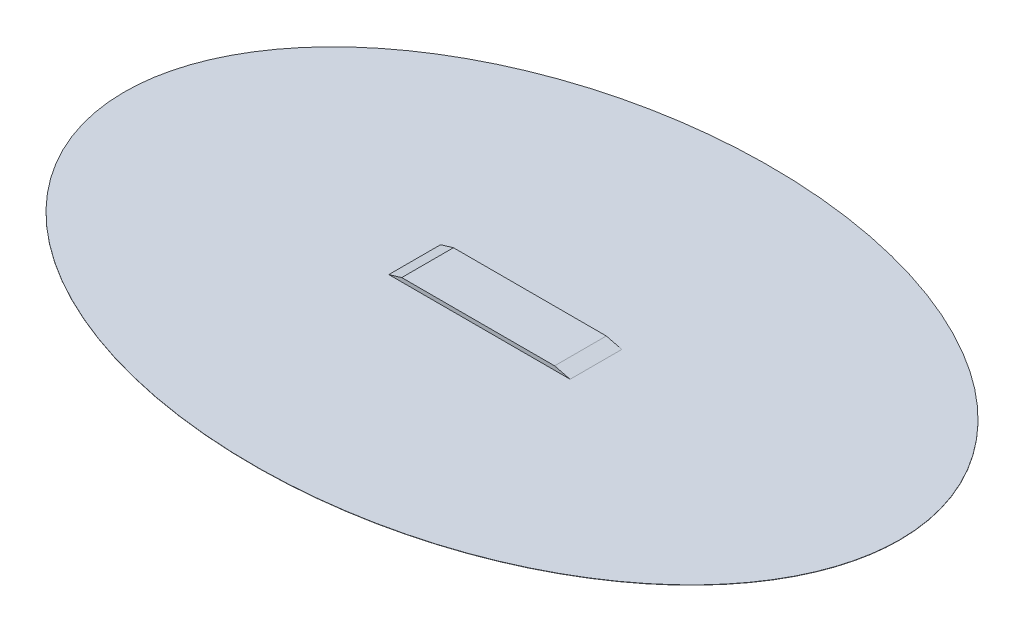
ISO-10303-21;
HEADER;
FILE_DESCRIPTION(('STEP AP214'),'2;1');
FILE_NAME('part.step','',(''),(''),'','','');
FILE_SCHEMA(('AUTOMOTIVE_DESIGN { 1 0 10303 214 1 1 1 1 }'));
ENDSEC;
DATA;
#1=APPLICATION_CONTEXT('core data for automotive mechanical design processes');
#2=APPLICATION_PROTOCOL_DEFINITION('international standard','automotive_design',2000,#1);
#3=PRODUCT_CONTEXT('',#1,'mechanical');
#4=PRODUCT('Part','Part','',(#3));
#5=PRODUCT_RELATED_PRODUCT_CATEGORY('part','',(#4));
#6=PRODUCT_DEFINITION_FORMATION('','',#4);
#7=PRODUCT_DEFINITION_CONTEXT('part definition',#1,'design');
#8=PRODUCT_DEFINITION('design','',#6,#7);
#9=PRODUCT_DEFINITION_SHAPE('','',#8);
#10=(LENGTH_UNIT() NAMED_UNIT(*) SI_UNIT(.MILLI.,.METRE.));
#11=(NAMED_UNIT(*) PLANE_ANGLE_UNIT() SI_UNIT($,.RADIAN.));
#12=(NAMED_UNIT(*) SI_UNIT($,.STERADIAN.) SOLID_ANGLE_UNIT());
#13=UNCERTAINTY_MEASURE_WITH_UNIT(LENGTH_MEASURE(1.E-05),#10,'distance_accuracy_value','');
#14=(GEOMETRIC_REPRESENTATION_CONTEXT(3) GLOBAL_UNCERTAINTY_ASSIGNED_CONTEXT((#13)) GLOBAL_UNIT_ASSIGNED_CONTEXT((#10,
#11,#12)) REPRESENTATION_CONTEXT('',''));
#15=CARTESIAN_POINT('',(0.,0.,0.));
#16=DIRECTION('',(0.,0.,1.));
#17=DIRECTION('',(1.,0.,0.));
#18=AXIS2_PLACEMENT_3D('',#15,#16,#17);
#19=CARTESIAN_POINT('',(0.,10.,0.));
#20=DIRECTION('',(0.,1.,0.));
#21=DIRECTION('',(1.,0.,0.));
#22=AXIS2_PLACEMENT_3D('',#19,#20,#21);
#23=ELLIPSE('',#22,15000.,10000.);
#24=DIRECTION('',(0.,-1.,0.));
#25=VECTOR('',#24,1.);
#26=SURFACE_OF_LINEAR_EXTRUSION('',#23,#25);
#27=CARTESIAN_POINT('',(15000.,10.,0.));
#28=VERTEX_POINT('',#27);
#29=EDGE_CURVE('E11',#28,#28,#23,.T.);
#30=ORIENTED_EDGE('',*,*,#29,.F.);
#31=EDGE_LOOP('',(#30));
#32=FACE_BOUND('',#31,.T.);
#33=CARTESIAN_POINT('',(0.,0.,0.));
#34=DIRECTION('',(0.,1.,0.));
#35=DIRECTION('',(1.,0.,0.));
#36=AXIS2_PLACEMENT_3D('',#33,#34,#35);
#37=ELLIPSE('',#36,15000.,10000.);
#38=CARTESIAN_POINT('',(15000.,0.,0.));
#39=VERTEX_POINT('',#38);
#40=EDGE_CURVE('E43',#39,#39,#37,.T.);
#41=ORIENTED_EDGE('',*,*,#40,.T.);
#42=EDGE_LOOP('',(#41));
#43=FACE_BOUND('',#42,.T.);
#44=ADVANCED_FACE('F39',(#32,#43),#26,.F.);
#45=CARTESIAN_POINT('',(0.,10.,0.));
#46=DIRECTION('',(0.,1.,0.));
#47=DIRECTION('',(0.,0.,1.));
#48=AXIS2_PLACEMENT_3D('',#45,#46,#47);
#49=PLANE('',#48);
#50=DIRECTION('',(1.,0.,0.));
#51=VECTOR('',#50,1.);
#52=CARTESIAN_POINT('',(3247.58058331461,10.,-1000.));
#53=LINE('',#52,#51);
#54=CARTESIAN_POINT('',(-3765.65306220773,10.,-1000.));
#55=VERTEX_POINT('',#54);
#56=CARTESIAN_POINT('',(3247.58058331461,10.,-1000.));
#57=VERTEX_POINT('',#56);
#58=EDGE_CURVE('E62',#55,#57,#53,.T.);
#59=ORIENTED_EDGE('',*,*,#58,.T.);
#60=DIRECTION('',(0.,0.,1.));
#61=VECTOR('',#60,1.);
#62=CARTESIAN_POINT('',(3247.58058331461,10.,-1000.));
#63=LINE('',#62,#61);
#64=CARTESIAN_POINT('',(3247.58058331461,10.,1000.));
#65=VERTEX_POINT('',#64);
#66=EDGE_CURVE('E87',#57,#65,#63,.T.);
#67=ORIENTED_EDGE('',*,*,#66,.T.);
#68=DIRECTION('',(1.,0.,0.));
#69=VECTOR('',#68,1.);
#70=CARTESIAN_POINT('',(3247.58058331461,10.,1000.));
#71=LINE('',#70,#69);
#72=CARTESIAN_POINT('',(-3765.65306220773,10.,1000.));
#73=VERTEX_POINT('',#72);
#74=EDGE_CURVE('E92',#73,#65,#71,.T.);
#75=ORIENTED_EDGE('',*,*,#74,.F.);
#76=DIRECTION('',(0.,0.,1.));
#77=VECTOR('',#76,1.);
#78=CARTESIAN_POINT('',(-3765.65306220773,10.,-1000.));
#79=LINE('',#78,#77);
#80=EDGE_CURVE('E115',#55,#73,#79,.T.);
#81=ORIENTED_EDGE('',*,*,#80,.F.);
#82=EDGE_LOOP('',(#59,#67,#75,#81));
#83=FACE_BOUND('',#82,.T.);
#84=ORIENTED_EDGE('',*,*,#29,.T.);
#85=EDGE_LOOP('',(#84));
#86=FACE_BOUND('',#85,.T.);
#87=ADVANCED_FACE('F100',(#83,#86),#49,.T.);
#88=CARTESIAN_POINT('',(0.,0.,0.));
#89=DIRECTION('',(0.,1.,0.));
#90=DIRECTION('',(0.,0.,1.));
#91=AXIS2_PLACEMENT_3D('',#88,#89,#90);
#92=PLANE('',#91);
#93=ORIENTED_EDGE('',*,*,#40,.F.);
#94=EDGE_LOOP('',(#93));
#95=FACE_BOUND('',#94,.T.);
#96=ADVANCED_FACE('F142',(#95),#92,.F.);
#97=CARTESIAN_POINT('',(-3765.65306220773,10.,-1000.));
#98=DIRECTION('',(-0.287347885566344,0.957826285221152,0.));
#99=DIRECTION('',(-0.957826285221152,-0.287347885566344,0.));
#100=AXIS2_PLACEMENT_3D('',#97,#98,#99);
#101=PLANE('',#100);
#102=ORIENTED_EDGE('',*,*,#80,.T.);
#103=DIRECTION('',(-0.957826285221152,-0.287347885566344,0.));
#104=VECTOR('',#103,1.);
#105=CARTESIAN_POINT('',(-3765.65306220773,10.,1000.));
#106=LINE('',#105,#104);
#107=CARTESIAN_POINT('',(-3265.65306220773,159.999999999999,1000.));
#108=VERTEX_POINT('',#107);
#109=EDGE_CURVE('E54',#108,#73,#106,.T.);
#110=ORIENTED_EDGE('',*,*,#109,.F.);
#111=DIRECTION('',(0.,0.,1.));
#112=VECTOR('',#111,1.);
#113=CARTESIAN_POINT('',(-3265.65306220773,159.999999999999,-1000.));
#114=LINE('',#113,#112);
#115=CARTESIAN_POINT('',(-3265.65306220773,159.999999999999,-1000.));
#116=VERTEX_POINT('',#115);
#117=EDGE_CURVE('E107',#116,#108,#114,.T.);
#118=ORIENTED_EDGE('',*,*,#117,.F.);
#119=DIRECTION('',(-0.957826285221152,-0.287347885566344,0.));
#120=VECTOR('',#119,1.);
#121=CARTESIAN_POINT('',(-3765.65306220773,10.,-1000.));
#122=LINE('',#121,#120);
#123=EDGE_CURVE('E103',#116,#55,#122,.T.);
#124=ORIENTED_EDGE('',*,*,#123,.T.);
#125=EDGE_LOOP('',(#102,#110,#118,#124));
#126=FACE_BOUND('',#125,.T.);
#127=ADVANCED_FACE('F131',(#126),#101,.T.);
#128=CARTESIAN_POINT('',(-3265.65306220773,159.999999999999,-1000.));
#129=DIRECTION('',(0.,1.,0.));
#130=DIRECTION('',(0.,0.,1.));
#131=AXIS2_PLACEMENT_3D('',#128,#129,#130);
#132=PLANE('',#131);
#133=ORIENTED_EDGE('',*,*,#117,.T.);
#134=DIRECTION('',(-1.,0.,0.));
#135=VECTOR('',#134,1.);
#136=CARTESIAN_POINT('',(-3265.65306220773,159.999999999999,1000.));
#137=LINE('',#136,#135);
#138=CARTESIAN_POINT('',(2647.58058331461,159.999999999999,1000.));
#139=VERTEX_POINT('',#138);
#140=EDGE_CURVE('E91',#139,#108,#137,.T.);
#141=ORIENTED_EDGE('',*,*,#140,.F.);
#142=DIRECTION('',(0.,0.,1.));
#143=VECTOR('',#142,1.);
#144=CARTESIAN_POINT('',(2647.58058331461,159.999999999999,-1000.));
#145=LINE('',#144,#143);
#146=CARTESIAN_POINT('',(2647.58058331461,159.999999999999,-1000.));
#147=VERTEX_POINT('',#146);
#148=EDGE_CURVE('E88',#147,#139,#145,.T.);
#149=ORIENTED_EDGE('',*,*,#148,.F.);
#150=DIRECTION('',(-1.,0.,0.));
#151=VECTOR('',#150,1.);
#152=CARTESIAN_POINT('',(-3265.65306220773,159.999999999999,-1000.));
#153=LINE('',#152,#151);
#154=EDGE_CURVE('E109',#147,#116,#153,.T.);
#155=ORIENTED_EDGE('',*,*,#154,.T.);
#156=EDGE_LOOP('',(#133,#141,#149,#155));
#157=FACE_BOUND('',#156,.T.);
#158=ADVANCED_FACE('F134',(#157),#132,.T.);
#159=CARTESIAN_POINT('',(2647.58058331461,159.999999999999,-1000.));
#160=DIRECTION('',(0.242535625036332,0.970142500145332,0.));
#161=DIRECTION('',(-0.970142500145332,0.242535625036332,0.));
#162=AXIS2_PLACEMENT_3D('',#159,#160,#161);
#163=PLANE('',#162);
#164=ORIENTED_EDGE('',*,*,#148,.T.);
#165=DIRECTION('',(-0.970142500145332,0.242535625036332,0.));
#166=VECTOR('',#165,1.);
#167=CARTESIAN_POINT('',(2647.58058331461,159.999999999999,1000.));
#168=LINE('',#167,#166);
#169=EDGE_CURVE('E83',#65,#139,#168,.T.);
#170=ORIENTED_EDGE('',*,*,#169,.F.);
#171=ORIENTED_EDGE('',*,*,#66,.F.);
#172=DIRECTION('',(-0.970142500145332,0.242535625036332,0.));
#173=VECTOR('',#172,1.);
#174=CARTESIAN_POINT('',(2647.58058331461,159.999999999999,-1000.));
#175=LINE('',#174,#173);
#176=EDGE_CURVE('E121',#57,#147,#175,.T.);
#177=ORIENTED_EDGE('',*,*,#176,.T.);
#178=EDGE_LOOP('',(#164,#170,#171,#177));
#179=FACE_BOUND('',#178,.T.);
#180=ADVANCED_FACE('F84',(#179),#163,.T.);
#181=CARTESIAN_POINT('',(0.,0.,-1000.));
#182=DIRECTION('',(0.,0.,-1.));
#183=DIRECTION('',(-1.,0.,0.));
#184=AXIS2_PLACEMENT_3D('',#181,#182,#183);
#185=PLANE('',#184);
#186=ORIENTED_EDGE('',*,*,#58,.F.);
#187=ORIENTED_EDGE('',*,*,#123,.F.);
#188=ORIENTED_EDGE('',*,*,#154,.F.);
#189=ORIENTED_EDGE('',*,*,#176,.F.);
#190=EDGE_LOOP('',(#186,#187,#188,#189));
#191=FACE_BOUND('',#190,.T.);
#192=ADVANCED_FACE('F133',(#191),#185,.T.);
#193=CARTESIAN_POINT('',(0.,0.,1000.));
#194=DIRECTION('',(0.,0.,-1.));
#195=DIRECTION('',(-1.,0.,0.));
#196=AXIS2_PLACEMENT_3D('',#193,#194,#195);
#197=PLANE('',#196);
#198=ORIENTED_EDGE('',*,*,#74,.T.);
#199=ORIENTED_EDGE('',*,*,#169,.T.);
#200=ORIENTED_EDGE('',*,*,#140,.T.);
#201=ORIENTED_EDGE('',*,*,#109,.T.);
#202=EDGE_LOOP('',(#198,#199,#200,#201));
#203=FACE_BOUND('',#202,.T.);
#204=ADVANCED_FACE('F95',(#203),#197,.F.);
#205=CLOSED_SHELL('',(#44,#87,#96,#127,#158,#180,#192,#204));
#206=MANIFOLD_SOLID_BREP('B2',#205);
#207=ADVANCED_BREP_SHAPE_REPRESENTATION('',(#18,#206),#14);
#208=SHAPE_DEFINITION_REPRESENTATION(#9,#207);
ENDSEC;
END-ISO-10303-21;
